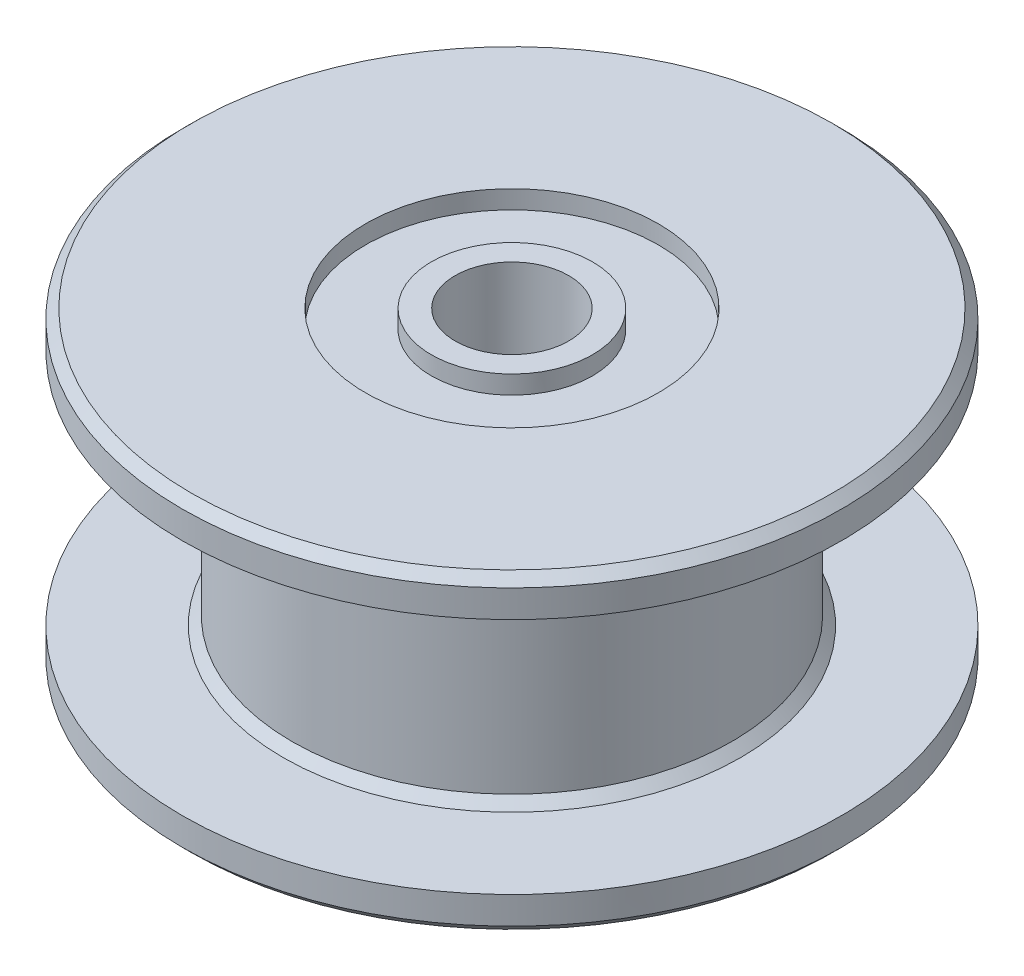
ISO-10303-21;
HEADER;
FILE_DESCRIPTION(('STEP AP214'),'2;1');
FILE_NAME('part.step','',(''),(''),'','','');
FILE_SCHEMA(('AUTOMOTIVE_DESIGN { 1 0 10303 214 1 1 1 1 }'));
ENDSEC;
DATA;
#1=APPLICATION_CONTEXT('core data for automotive mechanical design processes');
#2=APPLICATION_PROTOCOL_DEFINITION('international standard','automotive_design',2000,#1);
#3=PRODUCT_CONTEXT('',#1,'mechanical');
#4=PRODUCT('Part','Part','',(#3));
#5=PRODUCT_RELATED_PRODUCT_CATEGORY('part','',(#4));
#6=PRODUCT_DEFINITION_FORMATION('','',#4);
#7=PRODUCT_DEFINITION_CONTEXT('part definition',#1,'design');
#8=PRODUCT_DEFINITION('design','',#6,#7);
#9=PRODUCT_DEFINITION_SHAPE('','',#8);
#10=(LENGTH_UNIT() NAMED_UNIT(*) SI_UNIT(.MILLI.,.METRE.));
#11=(NAMED_UNIT(*) PLANE_ANGLE_UNIT() SI_UNIT($,.RADIAN.));
#12=(NAMED_UNIT(*) SI_UNIT($,.STERADIAN.) SOLID_ANGLE_UNIT());
#13=UNCERTAINTY_MEASURE_WITH_UNIT(LENGTH_MEASURE(1.E-05),#10,'distance_accuracy_value','');
#14=(GEOMETRIC_REPRESENTATION_CONTEXT(3) GLOBAL_UNCERTAINTY_ASSIGNED_CONTEXT((#13)) GLOBAL_UNIT_ASSIGNED_CONTEXT((#10,
#11,#12)) REPRESENTATION_CONTEXT('',''));
#15=CARTESIAN_POINT('',(0.,0.,0.));
#16=DIRECTION('',(0.,0.,1.));
#17=DIRECTION('',(1.,0.,0.));
#18=AXIS2_PLACEMENT_3D('',#15,#16,#17);
#19=CARTESIAN_POINT('',(0.,0.,0.));
#20=DIRECTION('',(0.,-1.,0.));
#21=DIRECTION('',(0.,0.,-1.));
#22=AXIS2_PLACEMENT_3D('',#19,#20,#21);
#23=PLANE('',#22);
#24=CARTESIAN_POINT('',(0.,0.,0.));
#25=DIRECTION('',(0.,-1.,0.));
#26=DIRECTION('',(0.,0.,-1.));
#27=AXIS2_PLACEMENT_3D('',#24,#25,#26);
#28=CIRCLE('',#27,8.75);
#29=CARTESIAN_POINT('',(0.,0.,-8.75));
#30=VERTEX_POINT('',#29);
#31=EDGE_CURVE('E57',#30,#30,#28,.T.);
#32=ORIENTED_EDGE('',*,*,#31,.T.);
#33=EDGE_LOOP('',(#32));
#34=FACE_BOUND('',#33,.T.);
#35=CARTESIAN_POINT('',(0.,0.,0.));
#36=DIRECTION('',(0.,-1.,0.));
#37=DIRECTION('',(0.,0.,-1.));
#38=AXIS2_PLACEMENT_3D('',#35,#36,#37);
#39=CIRCLE('',#38,4.);
#40=CARTESIAN_POINT('',(0.,0.,-4.));
#41=VERTEX_POINT('',#40);
#42=EDGE_CURVE('E73',#41,#41,#39,.T.);
#43=ORIENTED_EDGE('',*,*,#42,.F.);
#44=EDGE_LOOP('',(#43));
#45=FACE_BOUND('',#44,.T.);
#46=ADVANCED_FACE('F31',(#34,#45),#23,.T.);
#47=CARTESIAN_POINT('',(0.,8.5,0.));
#48=DIRECTION('',(0.,1.,0.));
#49=DIRECTION('',(0.,0.,1.));
#50=AXIS2_PLACEMENT_3D('',#47,#48,#49);
#51=CYLINDRICAL_SURFACE('',#50,9.);
#52=CARTESIAN_POINT('',(0.,0.25,0.));
#53=DIRECTION('',(0.,-1.,0.));
#54=DIRECTION('',(0.,0.,-1.));
#55=AXIS2_PLACEMENT_3D('',#52,#53,#54);
#56=CIRCLE('',#55,9.);
#57=CARTESIAN_POINT('',(0.,0.25,-9.));
#58=VERTEX_POINT('',#57);
#59=EDGE_CURVE('E60',#58,#58,#56,.F.);
#60=ORIENTED_EDGE('',*,*,#59,.T.);
#61=EDGE_LOOP('',(#60));
#62=FACE_BOUND('',#61,.T.);
#63=CARTESIAN_POINT('',(0.,0.999999999999999,0.));
#64=DIRECTION('',(0.,1.,0.));
#65=DIRECTION('',(0.,0.,1.));
#66=AXIS2_PLACEMENT_3D('',#63,#64,#65);
#67=CIRCLE('',#66,9.);
#68=CARTESIAN_POINT('',(0.,0.999999999999999,9.));
#69=VERTEX_POINT('',#68);
#70=EDGE_CURVE('E66',#69,#69,#67,.T.);
#71=ORIENTED_EDGE('',*,*,#70,.F.);
#72=EDGE_LOOP('',(#71));
#73=FACE_BOUND('',#72,.T.);
#74=ADVANCED_FACE('F137',(#62,#73),#51,.T.);
#75=CARTESIAN_POINT('',(-9.,0.999999999999999,0.));
#76=DIRECTION('',(0.,1.,0.));
#77=DIRECTION('',(0.,0.,1.));
#78=AXIS2_PLACEMENT_3D('',#75,#76,#77);
#79=PLANE('',#78);
#80=CARTESIAN_POINT('',(0.,0.999999999999999,0.));
#81=DIRECTION('',(0.,1.,0.));
#82=DIRECTION('',(0.,0.,1.));
#83=AXIS2_PLACEMENT_3D('',#80,#81,#82);
#84=CIRCLE('',#83,6.25);
#85=CARTESIAN_POINT('',(0.,0.999999999999999,6.25));
#86=VERTEX_POINT('',#85);
#87=EDGE_CURVE('E46',#86,#86,#84,.F.);
#88=ORIENTED_EDGE('',*,*,#87,.T.);
#89=EDGE_LOOP('',(#88));
#90=FACE_BOUND('',#89,.T.);
#91=ORIENTED_EDGE('',*,*,#70,.T.);
#92=EDGE_LOOP('',(#91));
#93=FACE_BOUND('',#92,.T.);
#94=ADVANCED_FACE('F144',(#90,#93),#79,.T.);
#95=CARTESIAN_POINT('',(0.,8.5,0.));
#96=DIRECTION('',(0.,1.,0.));
#97=DIRECTION('',(0.,0.,1.));
#98=AXIS2_PLACEMENT_3D('',#95,#96,#97);
#99=CYLINDRICAL_SURFACE('',#98,6.);
#100=CARTESIAN_POINT('',(0.,1.25,0.));
#101=DIRECTION('',(0.,1.,0.));
#102=DIRECTION('',(0.,0.,1.));
#103=AXIS2_PLACEMENT_3D('',#100,#101,#102);
#104=CIRCLE('',#103,6.);
#105=CARTESIAN_POINT('',(0.,1.25,6.));
#106=VERTEX_POINT('',#105);
#107=EDGE_CURVE('E51',#106,#106,#104,.T.);
#108=ORIENTED_EDGE('',*,*,#107,.T.);
#109=EDGE_LOOP('',(#108));
#110=FACE_BOUND('',#109,.T.);
#111=CARTESIAN_POINT('',(0.,7.25,0.));
#112=DIRECTION('',(0.,-1.,0.));
#113=DIRECTION('',(0.,0.,-1.));
#114=AXIS2_PLACEMENT_3D('',#111,#112,#113);
#115=CIRCLE('',#114,6.);
#116=CARTESIAN_POINT('',(0.,7.25,-6.));
#117=VERTEX_POINT('',#116);
#118=EDGE_CURVE('E54',#117,#117,#115,.T.);
#119=ORIENTED_EDGE('',*,*,#118,.T.);
#120=EDGE_LOOP('',(#119));
#121=FACE_BOUND('',#120,.T.);
#122=ADVANCED_FACE('F170',(#110,#121),#99,.T.);
#123=CARTESIAN_POINT('',(-6.,7.5,0.));
#124=DIRECTION('',(0.,-1.,0.));
#125=DIRECTION('',(0.,0.,-1.));
#126=AXIS2_PLACEMENT_3D('',#123,#124,#125);
#127=PLANE('',#126);
#128=CARTESIAN_POINT('',(0.,7.5,0.));
#129=DIRECTION('',(0.,-1.,0.));
#130=DIRECTION('',(0.,0.,-1.));
#131=AXIS2_PLACEMENT_3D('',#128,#129,#130);
#132=CIRCLE('',#131,6.25);
#133=CARTESIAN_POINT('',(0.,7.5,-6.25));
#134=VERTEX_POINT('',#133);
#135=EDGE_CURVE('E42',#134,#134,#132,.F.);
#136=ORIENTED_EDGE('',*,*,#135,.T.);
#137=EDGE_LOOP('',(#136));
#138=FACE_BOUND('',#137,.T.);
#139=CARTESIAN_POINT('',(0.,7.5,0.));
#140=DIRECTION('',(0.,1.,0.));
#141=DIRECTION('',(0.,0.,1.));
#142=AXIS2_PLACEMENT_3D('',#139,#140,#141);
#143=CIRCLE('',#142,9.);
#144=CARTESIAN_POINT('',(0.,7.5,9.));
#145=VERTEX_POINT('',#144);
#146=EDGE_CURVE('E69',#145,#145,#143,.T.);
#147=ORIENTED_EDGE('',*,*,#146,.F.);
#148=EDGE_LOOP('',(#147));
#149=FACE_BOUND('',#148,.T.);
#150=ADVANCED_FACE('F166',(#138,#149),#127,.T.);
#151=CARTESIAN_POINT('',(0.,8.5,0.));
#152=DIRECTION('',(0.,1.,0.));
#153=DIRECTION('',(0.,0.,1.));
#154=AXIS2_PLACEMENT_3D('',#151,#152,#153);
#155=CYLINDRICAL_SURFACE('',#154,9.);
#156=CARTESIAN_POINT('',(0.,8.25,0.));
#157=DIRECTION('',(0.,1.,0.));
#158=DIRECTION('',(0.,0.,1.));
#159=AXIS2_PLACEMENT_3D('',#156,#157,#158);
#160=CIRCLE('',#159,9.);
#161=CARTESIAN_POINT('',(0.,8.25,9.));
#162=VERTEX_POINT('',#161);
#163=EDGE_CURVE('E10',#162,#162,#160,.F.);
#164=ORIENTED_EDGE('',*,*,#163,.T.);
#165=EDGE_LOOP('',(#164));
#166=FACE_BOUND('',#165,.T.);
#167=ORIENTED_EDGE('',*,*,#146,.T.);
#168=EDGE_LOOP('',(#167));
#169=FACE_BOUND('',#168,.T.);
#170=ADVANCED_FACE('F169',(#166,#169),#155,.T.);
#171=CARTESIAN_POINT('',(-9.,8.5,0.));
#172=DIRECTION('',(0.,1.,0.));
#173=DIRECTION('',(0.,0.,1.));
#174=AXIS2_PLACEMENT_3D('',#171,#172,#173);
#175=PLANE('',#174);
#176=CARTESIAN_POINT('',(0.,8.5,0.));
#177=DIRECTION('',(0.,1.,0.));
#178=DIRECTION('',(0.,0.,1.));
#179=AXIS2_PLACEMENT_3D('',#176,#177,#178);
#180=CIRCLE('',#179,8.75);
#181=CARTESIAN_POINT('',(0.,8.5,8.75));
#182=VERTEX_POINT('',#181);
#183=EDGE_CURVE('E38',#182,#182,#180,.T.);
#184=ORIENTED_EDGE('',*,*,#183,.T.);
#185=EDGE_LOOP('',(#184));
#186=FACE_BOUND('',#185,.T.);
#187=CARTESIAN_POINT('',(0.,8.5,0.));
#188=DIRECTION('',(0.,-1.,0.));
#189=DIRECTION('',(0.,0.,-1.));
#190=AXIS2_PLACEMENT_3D('',#187,#188,#189);
#191=CIRCLE('',#190,4.);
#192=CARTESIAN_POINT('',(0.,8.5,-4.));
#193=VERTEX_POINT('',#192);
#194=EDGE_CURVE('E85',#193,#193,#191,.T.);
#195=ORIENTED_EDGE('',*,*,#194,.T.);
#196=EDGE_LOOP('',(#195));
#197=FACE_BOUND('',#196,.T.);
#198=ADVANCED_FACE('F132',(#186,#197),#175,.T.);
#199=CARTESIAN_POINT('',(0.,0.5,0.));
#200=DIRECTION('',(0.,-1.,0.));
#201=DIRECTION('',(0.,0.,-1.));
#202=AXIS2_PLACEMENT_3D('',#199,#200,#201);
#203=CYLINDRICAL_SURFACE('',#202,4.);
#204=CARTESIAN_POINT('',(0.,0.5,0.));
#205=DIRECTION('',(0.,-1.,0.));
#206=DIRECTION('',(0.,0.,-1.));
#207=AXIS2_PLACEMENT_3D('',#204,#205,#206);
#208=CIRCLE('',#207,4.);
#209=CARTESIAN_POINT('',(0.,0.5,-4.));
#210=VERTEX_POINT('',#209);
#211=EDGE_CURVE('E72',#210,#210,#208,.T.);
#212=ORIENTED_EDGE('',*,*,#211,.F.);
#213=EDGE_LOOP('',(#212));
#214=FACE_BOUND('',#213,.T.);
#215=ORIENTED_EDGE('',*,*,#42,.T.);
#216=EDGE_LOOP('',(#215));
#217=FACE_BOUND('',#216,.T.);
#218=ADVANCED_FACE('F126',(#214,#217),#203,.F.);
#219=CARTESIAN_POINT('',(0.,0.5,0.));
#220=DIRECTION('',(0.,-1.,0.));
#221=DIRECTION('',(0.,0.,-1.));
#222=AXIS2_PLACEMENT_3D('',#219,#220,#221);
#223=PLANE('',#222);
#224=CARTESIAN_POINT('',(0.,0.5,0.));
#225=DIRECTION('',(0.,-1.,0.));
#226=DIRECTION('',(0.,0.,-1.));
#227=AXIS2_PLACEMENT_3D('',#224,#225,#226);
#228=CIRCLE('',#227,2.2);
#229=CARTESIAN_POINT('',(0.,0.5,-2.2));
#230=VERTEX_POINT('',#229);
#231=EDGE_CURVE('E79',#230,#230,#228,.T.);
#232=ORIENTED_EDGE('',*,*,#231,.F.);
#233=EDGE_LOOP('',(#232));
#234=FACE_BOUND('',#233,.T.);
#235=ORIENTED_EDGE('',*,*,#211,.T.);
#236=EDGE_LOOP('',(#235));
#237=FACE_BOUND('',#236,.T.);
#238=ADVANCED_FACE('F120',(#234,#237),#223,.T.);
#239=CARTESIAN_POINT('',(0.,0.,0.));
#240=DIRECTION('',(0.,1.,0.));
#241=DIRECTION('',(0.,0.,1.));
#242=AXIS2_PLACEMENT_3D('',#239,#240,#241);
#243=CYLINDRICAL_SURFACE('',#242,2.2);
#244=CARTESIAN_POINT('',(0.,0.,0.));
#245=DIRECTION('',(0.,-1.,0.));
#246=DIRECTION('',(0.,0.,-1.));
#247=AXIS2_PLACEMENT_3D('',#244,#245,#246);
#248=CIRCLE('',#247,2.2);
#249=CARTESIAN_POINT('',(0.,0.,-2.2));
#250=VERTEX_POINT('',#249);
#251=EDGE_CURVE('E76',#250,#250,#248,.T.);
#252=ORIENTED_EDGE('',*,*,#251,.F.);
#253=EDGE_LOOP('',(#252));
#254=FACE_BOUND('',#253,.T.);
#255=ORIENTED_EDGE('',*,*,#231,.T.);
#256=EDGE_LOOP('',(#255));
#257=FACE_BOUND('',#256,.T.);
#258=ADVANCED_FACE('F114',(#254,#257),#243,.T.);
#259=CARTESIAN_POINT('',(0.,0.,0.));
#260=DIRECTION('',(0.,-1.,0.));
#261=DIRECTION('',(0.,0.,-1.));
#262=AXIS2_PLACEMENT_3D('',#259,#260,#261);
#263=PLANE('',#262);
#264=CARTESIAN_POINT('',(0.,0.,0.));
#265=DIRECTION('',(0.,-1.,0.));
#266=DIRECTION('',(0.,0.,-1.));
#267=AXIS2_PLACEMENT_3D('',#264,#265,#266);
#268=CIRCLE('',#267,1.55);
#269=CARTESIAN_POINT('',(0.,0.,-1.55));
#270=VERTEX_POINT('',#269);
#271=EDGE_CURVE('E94',#270,#270,#268,.T.);
#272=ORIENTED_EDGE('',*,*,#271,.F.);
#273=EDGE_LOOP('',(#272));
#274=FACE_BOUND('',#273,.T.);
#275=ORIENTED_EDGE('',*,*,#251,.T.);
#276=EDGE_LOOP('',(#275));
#277=FACE_BOUND('',#276,.T.);
#278=ADVANCED_FACE('F110',(#274,#277),#263,.T.);
#279=CARTESIAN_POINT('',(0.,8.,0.));
#280=DIRECTION('',(0.,1.,0.));
#281=DIRECTION('',(0.,0.,1.));
#282=AXIS2_PLACEMENT_3D('',#279,#280,#281);
#283=CYLINDRICAL_SURFACE('',#282,4.);
#284=CARTESIAN_POINT('',(0.,8.,0.));
#285=DIRECTION('',(0.,-1.,0.));
#286=DIRECTION('',(0.,0.,-1.));
#287=AXIS2_PLACEMENT_3D('',#284,#285,#286);
#288=CIRCLE('',#287,4.);
#289=CARTESIAN_POINT('',(0.,8.,-4.));
#290=VERTEX_POINT('',#289);
#291=EDGE_CURVE('E82',#290,#290,#288,.T.);
#292=ORIENTED_EDGE('',*,*,#291,.T.);
#293=EDGE_LOOP('',(#292));
#294=FACE_BOUND('',#293,.T.);
#295=ORIENTED_EDGE('',*,*,#194,.F.);
#296=EDGE_LOOP('',(#295));
#297=FACE_BOUND('',#296,.T.);
#298=ADVANCED_FACE('F113',(#294,#297),#283,.F.);
#299=CARTESIAN_POINT('',(0.,8.,0.));
#300=DIRECTION('',(0.,1.,0.));
#301=DIRECTION('',(0.,0.,-1.));
#302=AXIS2_PLACEMENT_3D('',#299,#300,#301);
#303=PLANE('',#302);
#304=CARTESIAN_POINT('',(0.,8.,0.));
#305=DIRECTION('',(0.,1.,0.));
#306=DIRECTION('',(0.,0.,1.));
#307=AXIS2_PLACEMENT_3D('',#304,#305,#306);
#308=CIRCLE('',#307,2.2);
#309=CARTESIAN_POINT('',(0.,8.,2.2));
#310=VERTEX_POINT('',#309);
#311=EDGE_CURVE('E63',#310,#310,#308,.T.);
#312=ORIENTED_EDGE('',*,*,#311,.F.);
#313=EDGE_LOOP('',(#312));
#314=FACE_BOUND('',#313,.T.);
#315=ORIENTED_EDGE('',*,*,#291,.F.);
#316=EDGE_LOOP('',(#315));
#317=FACE_BOUND('',#316,.T.);
#318=ADVANCED_FACE('F241',(#314,#317),#303,.T.);
#319=CARTESIAN_POINT('',(0.,8.5,0.));
#320=DIRECTION('',(0.,-1.,0.));
#321=DIRECTION('',(0.,0.,-1.));
#322=AXIS2_PLACEMENT_3D('',#319,#320,#321);
#323=CYLINDRICAL_SURFACE('',#322,2.2);
#324=CARTESIAN_POINT('',(0.,8.5,0.));
#325=DIRECTION('',(0.,-1.,0.));
#326=DIRECTION('',(0.,0.,-1.));
#327=AXIS2_PLACEMENT_3D('',#324,#325,#326);
#328=CIRCLE('',#327,2.2);
#329=CARTESIAN_POINT('',(0.,8.5,-2.2));
#330=VERTEX_POINT('',#329);
#331=EDGE_CURVE('E88',#330,#330,#328,.T.);
#332=ORIENTED_EDGE('',*,*,#331,.T.);
#333=EDGE_LOOP('',(#332));
#334=FACE_BOUND('',#333,.T.);
#335=ORIENTED_EDGE('',*,*,#311,.T.);
#336=EDGE_LOOP('',(#335));
#337=FACE_BOUND('',#336,.T.);
#338=ADVANCED_FACE('F249',(#334,#337),#323,.T.);
#339=CARTESIAN_POINT('',(0.,8.5,0.));
#340=DIRECTION('',(0.,1.,0.));
#341=DIRECTION('',(0.,0.,-1.));
#342=AXIS2_PLACEMENT_3D('',#339,#340,#341);
#343=PLANE('',#342);
#344=CARTESIAN_POINT('',(0.,8.5,0.));
#345=DIRECTION('',(0.,-1.,0.));
#346=DIRECTION('',(0.,0.,-1.));
#347=AXIS2_PLACEMENT_3D('',#344,#345,#346);
#348=CIRCLE('',#347,1.55);
#349=CARTESIAN_POINT('',(0.,8.5,-1.55));
#350=VERTEX_POINT('',#349);
#351=EDGE_CURVE('E93',#350,#350,#348,.T.);
#352=ORIENTED_EDGE('',*,*,#351,.T.);
#353=EDGE_LOOP('',(#352));
#354=FACE_BOUND('',#353,.T.);
#355=ORIENTED_EDGE('',*,*,#331,.F.);
#356=EDGE_LOOP('',(#355));
#357=FACE_BOUND('',#356,.T.);
#358=ADVANCED_FACE('F100',(#354,#357),#343,.T.);
#359=CARTESIAN_POINT('',(0.,8.5,0.));
#360=DIRECTION('',(0.,-1.,0.));
#361=DIRECTION('',(0.,0.,-1.));
#362=AXIS2_PLACEMENT_3D('',#359,#360,#361);
#363=CYLINDRICAL_SURFACE('',#362,1.55);
#364=ORIENTED_EDGE('',*,*,#351,.F.);
#365=EDGE_LOOP('',(#364));
#366=FACE_BOUND('',#365,.T.);
#367=ORIENTED_EDGE('',*,*,#271,.T.);
#368=EDGE_LOOP('',(#367));
#369=FACE_BOUND('',#368,.T.);
#370=ADVANCED_FACE('F103',(#366,#369),#363,.F.);
#371=CARTESIAN_POINT('',(0.,0.25,0.));
#372=DIRECTION('',(0.,1.,0.));
#373=DIRECTION('',(0.,0.,1.));
#374=AXIS2_PLACEMENT_3D('',#371,#372,#373);
#375=CONICAL_SURFACE('',#374,9.,0.785398163397452);
#376=ORIENTED_EDGE('',*,*,#31,.F.);
#377=EDGE_LOOP('',(#376));
#378=FACE_BOUND('',#377,.T.);
#379=ORIENTED_EDGE('',*,*,#59,.F.);
#380=EDGE_LOOP('',(#379));
#381=FACE_BOUND('',#380,.T.);
#382=ADVANCED_FACE('F106',(#378,#381),#375,.T.);
#383=CARTESIAN_POINT('',(0.,1.25,0.));
#384=DIRECTION('',(0.,-1.,0.));
#385=DIRECTION('',(0.,0.,-1.));
#386=AXIS2_PLACEMENT_3D('',#383,#384,#385);
#387=CONICAL_SURFACE('',#386,6.,0.785398163397452);
#388=ORIENTED_EDGE('',*,*,#87,.F.);
#389=EDGE_LOOP('',(#388));
#390=FACE_BOUND('',#389,.T.);
#391=ORIENTED_EDGE('',*,*,#107,.F.);
#392=EDGE_LOOP('',(#391));
#393=FACE_BOUND('',#392,.T.);
#394=ADVANCED_FACE('F151',(#390,#393),#387,.T.);
#395=CARTESIAN_POINT('',(0.,7.5,0.));
#396=DIRECTION('',(0.,1.,0.));
#397=DIRECTION('',(0.,0.,1.));
#398=AXIS2_PLACEMENT_3D('',#395,#396,#397);
#399=CONICAL_SURFACE('',#398,6.25,0.785398163397448);
#400=ORIENTED_EDGE('',*,*,#118,.F.);
#401=EDGE_LOOP('',(#400));
#402=FACE_BOUND('',#401,.T.);
#403=ORIENTED_EDGE('',*,*,#135,.F.);
#404=EDGE_LOOP('',(#403));
#405=FACE_BOUND('',#404,.T.);
#406=ADVANCED_FACE('F154',(#402,#405),#399,.T.);
#407=CARTESIAN_POINT('',(0.,8.5,0.));
#408=DIRECTION('',(0.,-1.,0.));
#409=DIRECTION('',(0.,0.,-1.));
#410=AXIS2_PLACEMENT_3D('',#407,#408,#409);
#411=CONICAL_SURFACE('',#410,8.75,0.785398163397448);
#412=ORIENTED_EDGE('',*,*,#163,.F.);
#413=EDGE_LOOP('',(#412));
#414=FACE_BOUND('',#413,.T.);
#415=ORIENTED_EDGE('',*,*,#183,.F.);
#416=EDGE_LOOP('',(#415));
#417=FACE_BOUND('',#416,.T.);
#418=ADVANCED_FACE('F33',(#414,#417),#411,.T.);
#419=CLOSED_SHELL('',(#46,#74,#94,#122,#150,#170,#198,#218,#238,#258,#278,#298,#318,#338,#358,
#370,#382,#394,#406,#418));
#420=MANIFOLD_SOLID_BREP('B2',#419);
#421=ADVANCED_BREP_SHAPE_REPRESENTATION('',(#18,#420),#14);
#422=SHAPE_DEFINITION_REPRESENTATION(#9,#421);
ENDSEC;
END-ISO-10303-21;
